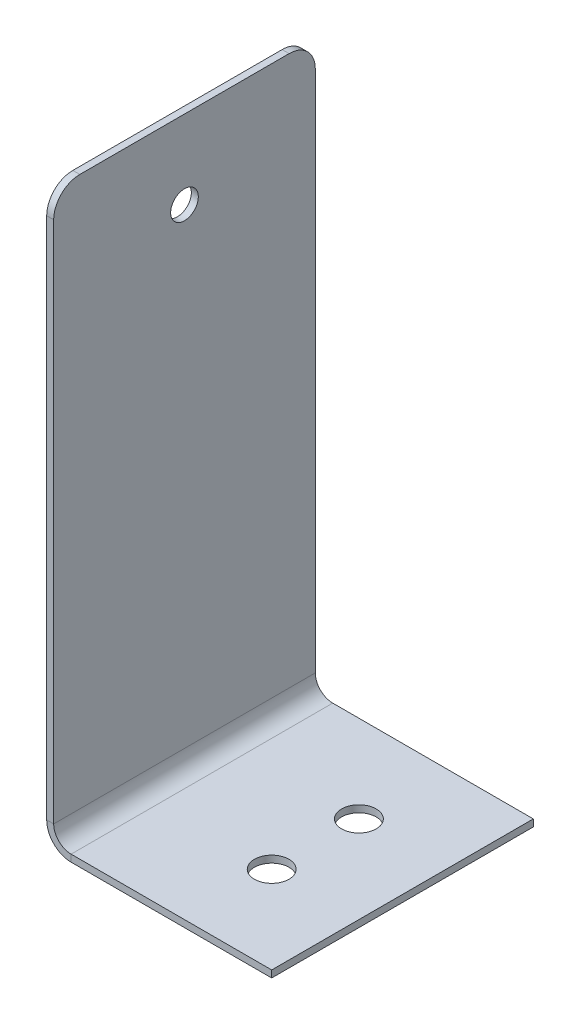
ISO-10303-21;
HEADER;
FILE_DESCRIPTION(('STEP AP214'),'2;1');
FILE_NAME('part.step','',(''),(''),'','','');
FILE_SCHEMA(('AUTOMOTIVE_DESIGN { 1 0 10303 214 1 1 1 1 }'));
ENDSEC;
DATA;
#1=APPLICATION_CONTEXT('core data for automotive mechanical design processes');
#2=APPLICATION_PROTOCOL_DEFINITION('international standard','automotive_design',2000,#1);
#3=PRODUCT_CONTEXT('',#1,'mechanical');
#4=PRODUCT('Part','Part','',(#3));
#5=PRODUCT_RELATED_PRODUCT_CATEGORY('part','',(#4));
#6=PRODUCT_DEFINITION_FORMATION('','',#4);
#7=PRODUCT_DEFINITION_CONTEXT('part definition',#1,'design');
#8=PRODUCT_DEFINITION('design','',#6,#7);
#9=PRODUCT_DEFINITION_SHAPE('','',#8);
#10=(LENGTH_UNIT() NAMED_UNIT(*) SI_UNIT(.MILLI.,.METRE.));
#11=(NAMED_UNIT(*) PLANE_ANGLE_UNIT() SI_UNIT($,.RADIAN.));
#12=(NAMED_UNIT(*) SI_UNIT($,.STERADIAN.) SOLID_ANGLE_UNIT());
#13=UNCERTAINTY_MEASURE_WITH_UNIT(LENGTH_MEASURE(1.E-05),#10,'distance_accuracy_value','');
#14=(GEOMETRIC_REPRESENTATION_CONTEXT(3) GLOBAL_UNCERTAINTY_ASSIGNED_CONTEXT((#13)) GLOBAL_UNIT_ASSIGNED_CONTEXT((#10,
#11,#12)) REPRESENTATION_CONTEXT('',''));
#15=CARTESIAN_POINT('',(0.,0.,0.));
#16=DIRECTION('',(0.,0.,1.));
#17=DIRECTION('',(1.,0.,0.));
#18=AXIS2_PLACEMENT_3D('',#15,#16,#17);
#19=CARTESIAN_POINT('',(2.,0.,15.));
#20=DIRECTION('',(0.,0.,1.));
#21=DIRECTION('',(1.,0.,0.));
#22=AXIS2_PLACEMENT_3D('',#19,#20,#21);
#23=PLANE('',#22);
#24=DIRECTION('',(0.,-1.,0.));
#25=VECTOR('',#24,1.);
#26=CARTESIAN_POINT('',(2.,0.,15.));
#27=LINE('',#26,#25);
#28=CARTESIAN_POINT('',(2.,0.,15.));
#29=VERTEX_POINT('',#28);
#30=CARTESIAN_POINT('',(2.,-0.800000000000001,15.));
#31=VERTEX_POINT('',#30);
#32=EDGE_CURVE('E197',#29,#31,#27,.T.);
#33=ORIENTED_EDGE('',*,*,#32,.F.);
#34=CARTESIAN_POINT('',(2.,2.,15.));
#35=DIRECTION('',(0.,0.,-1.));
#36=DIRECTION('',(-1.,0.,0.));
#37=AXIS2_PLACEMENT_3D('',#34,#35,#36);
#38=CIRCLE('',#37,2.);
#39=CARTESIAN_POINT('',(0.,2.,15.));
#40=VERTEX_POINT('',#39);
#41=EDGE_CURVE('E165',#40,#29,#38,.F.);
#42=ORIENTED_EDGE('',*,*,#41,.F.);
#43=DIRECTION('',(1.,0.,0.));
#44=VECTOR('',#43,1.);
#45=CARTESIAN_POINT('',(-0.799999999999995,2.,15.));
#46=LINE('',#45,#44);
#47=CARTESIAN_POINT('',(-0.799999999999995,2.,15.));
#48=VERTEX_POINT('',#47);
#49=EDGE_CURVE('E194',#48,#40,#46,.T.);
#50=ORIENTED_EDGE('',*,*,#49,.F.);
#51=CARTESIAN_POINT('',(2.,2.,15.));
#52=DIRECTION('',(0.,0.,1.));
#53=DIRECTION('',(1.,0.,0.));
#54=AXIS2_PLACEMENT_3D('',#51,#52,#53);
#55=CIRCLE('',#54,2.8);
#56=EDGE_CURVE('E172',#48,#31,#55,.T.);
#57=ORIENTED_EDGE('',*,*,#56,.T.);
#58=EDGE_LOOP('',(#33,#42,#50,#57));
#59=FACE_BOUND('',#58,.T.);
#60=ADVANCED_FACE('F38',(#59),#23,.T.);
#61=CARTESIAN_POINT('',(-0.799999999999995,2.,15.));
#62=DIRECTION('',(0.,0.,1.));
#63=DIRECTION('',(1.,0.,0.));
#64=AXIS2_PLACEMENT_3D('',#61,#62,#63);
#65=PLANE('',#64);
#66=DIRECTION('',(1.,0.,0.));
#67=VECTOR('',#66,1.);
#68=CARTESIAN_POINT('',(0.,0.,15.));
#69=LINE('',#68,#67);
#70=CARTESIAN_POINT('',(25.,0.,15.));
#71=VERTEX_POINT('',#70);
#72=EDGE_CURVE('E162',#29,#71,#69,.T.);
#73=ORIENTED_EDGE('',*,*,#72,.F.);
#74=ORIENTED_EDGE('',*,*,#32,.T.);
#75=DIRECTION('',(1.,0.,0.));
#76=VECTOR('',#75,1.);
#77=CARTESIAN_POINT('',(0.,-0.800000000000001,15.));
#78=LINE('',#77,#76);
#79=CARTESIAN_POINT('',(25.,-0.800000000000001,15.));
#80=VERTEX_POINT('',#79);
#81=EDGE_CURVE('E159',#31,#80,#78,.T.);
#82=ORIENTED_EDGE('',*,*,#81,.T.);
#83=DIRECTION('',(0.,-1.,0.));
#84=VECTOR('',#83,1.);
#85=CARTESIAN_POINT('',(25.,0.,15.));
#86=LINE('',#85,#84);
#87=EDGE_CURVE('E122',#71,#80,#86,.T.);
#88=ORIENTED_EDGE('',*,*,#87,.F.);
#89=EDGE_LOOP('',(#73,#74,#82,#88));
#90=FACE_BOUND('',#89,.T.);
#91=ADVANCED_FACE('F244',(#90),#65,.T.);
#92=CARTESIAN_POINT('',(0.,2.,-15.));
#93=DIRECTION('',(0.,0.,-1.));
#94=DIRECTION('',(-1.,0.,0.));
#95=AXIS2_PLACEMENT_3D('',#92,#93,#94);
#96=PLANE('',#95);
#97=DIRECTION('',(-1.,0.,0.));
#98=VECTOR('',#97,1.);
#99=CARTESIAN_POINT('',(0.,2.,-15.));
#100=LINE('',#99,#98);
#101=CARTESIAN_POINT('',(0.,2.,-15.));
#102=VERTEX_POINT('',#101);
#103=CARTESIAN_POINT('',(-0.799999999999995,2.,-15.));
#104=VERTEX_POINT('',#103);
#105=EDGE_CURVE('E191',#102,#104,#100,.T.);
#106=ORIENTED_EDGE('',*,*,#105,.F.);
#107=CARTESIAN_POINT('',(2.,2.,-15.));
#108=DIRECTION('',(0.,0.,-1.));
#109=DIRECTION('',(-1.,0.,0.));
#110=AXIS2_PLACEMENT_3D('',#107,#108,#109);
#111=CIRCLE('',#110,2.);
#112=CARTESIAN_POINT('',(2.,0.,-15.));
#113=VERTEX_POINT('',#112);
#114=EDGE_CURVE('E150',#102,#113,#111,.F.);
#115=ORIENTED_EDGE('',*,*,#114,.T.);
#116=DIRECTION('',(0.,1.,0.));
#117=VECTOR('',#116,1.);
#118=CARTESIAN_POINT('',(2.,-0.800000000000001,-15.));
#119=LINE('',#118,#117);
#120=CARTESIAN_POINT('',(2.,-0.800000000000001,-15.));
#121=VERTEX_POINT('',#120);
#122=EDGE_CURVE('E126',#121,#113,#119,.T.);
#123=ORIENTED_EDGE('',*,*,#122,.F.);
#124=CARTESIAN_POINT('',(2.,2.,-15.));
#125=DIRECTION('',(0.,0.,1.));
#126=DIRECTION('',(1.,0.,0.));
#127=AXIS2_PLACEMENT_3D('',#124,#125,#126);
#128=CIRCLE('',#127,2.8);
#129=EDGE_CURVE('E157',#104,#121,#128,.T.);
#130=ORIENTED_EDGE('',*,*,#129,.F.);
#131=EDGE_LOOP('',(#106,#115,#123,#130));
#132=FACE_BOUND('',#131,.T.);
#133=ADVANCED_FACE('F246',(#132),#96,.T.);
#134=CARTESIAN_POINT('',(2.,-0.800000000000001,-15.));
#135=DIRECTION('',(0.,0.,-1.));
#136=DIRECTION('',(-1.,0.,0.));
#137=AXIS2_PLACEMENT_3D('',#134,#135,#136);
#138=PLANE('',#137);
#139=DIRECTION('',(0.,1.,0.));
#140=VECTOR('',#139,1.);
#141=CARTESIAN_POINT('',(-0.799999999999995,0.,-15.));
#142=LINE('',#141,#140);
#143=CARTESIAN_POINT('',(-0.800000000000023,62.,-15.));
#144=VERTEX_POINT('',#143);
#145=EDGE_CURVE('E155',#144,#104,#142,.F.);
#146=ORIENTED_EDGE('',*,*,#145,.F.);
#147=DIRECTION('',(1.,0.,0.));
#148=VECTOR('',#147,1.);
#149=CARTESIAN_POINT('',(1.99999999999997,62.0000000000001,-15.));
#150=LINE('',#149,#148);
#151=CARTESIAN_POINT('',(0.,62.,-15.));
#152=VERTEX_POINT('',#151);
#153=EDGE_CURVE('E199',#144,#152,#150,.T.);
#154=ORIENTED_EDGE('',*,*,#153,.T.);
#155=DIRECTION('',(0.,-1.,0.));
#156=VECTOR('',#155,1.);
#157=CARTESIAN_POINT('',(0.,0.,-15.));
#158=LINE('',#157,#156);
#159=EDGE_CURVE('E153',#152,#102,#158,.T.);
#160=ORIENTED_EDGE('',*,*,#159,.T.);
#161=ORIENTED_EDGE('',*,*,#105,.T.);
#162=EDGE_LOOP('',(#146,#154,#160,#161));
#163=FACE_BOUND('',#162,.T.);
#164=ADVANCED_FACE('F219',(#163),#138,.T.);
#165=CARTESIAN_POINT('',(0.,-0.800000000000001,15.));
#166=DIRECTION('',(0.,1.,0.));
#167=DIRECTION('',(0.,0.,1.));
#168=AXIS2_PLACEMENT_3D('',#165,#166,#167);
#169=PLANE('',#168);
#170=CARTESIAN_POINT('',(15.,-0.800000000000002,-5.));
#171=DIRECTION('',(0.,1.,0.));
#172=DIRECTION('',(0.,0.,1.));
#173=AXIS2_PLACEMENT_3D('',#170,#171,#172);
#174=CIRCLE('',#173,1.984375);
#175=CARTESIAN_POINT('',(15.,-0.800000000000002,-3.015625));
#176=VERTEX_POINT('',#175);
#177=EDGE_CURVE('E448',#176,#176,#174,.T.);
#178=ORIENTED_EDGE('',*,*,#177,.T.);
#179=EDGE_LOOP('',(#178));
#180=FACE_BOUND('',#179,.T.);
#181=CARTESIAN_POINT('',(15.,-0.800000000000002,5.));
#182=DIRECTION('',(0.,1.,0.));
#183=DIRECTION('',(0.,0.,1.));
#184=AXIS2_PLACEMENT_3D('',#181,#182,#183);
#185=CIRCLE('',#184,1.984375);
#186=CARTESIAN_POINT('',(15.,-0.800000000000002,6.984375));
#187=VERTEX_POINT('',#186);
#188=EDGE_CURVE('E451',#187,#187,#185,.T.);
#189=ORIENTED_EDGE('',*,*,#188,.T.);
#190=EDGE_LOOP('',(#189));
#191=FACE_BOUND('',#190,.T.);
#192=DIRECTION('',(0.,0.,-1.));
#193=VECTOR('',#192,1.);
#194=CARTESIAN_POINT('',(2.,-0.800000000000001,15.));
#195=LINE('',#194,#193);
#196=EDGE_CURVE('E141',#31,#121,#195,.T.);
#197=ORIENTED_EDGE('',*,*,#196,.T.);
#198=DIRECTION('',(1.,0.,0.));
#199=VECTOR('',#198,1.);
#200=CARTESIAN_POINT('',(0.,-0.800000000000001,-15.));
#201=LINE('',#200,#199);
#202=CARTESIAN_POINT('',(25.,-0.800000000000001,-15.));
#203=VERTEX_POINT('',#202);
#204=EDGE_CURVE('E133',#121,#203,#201,.T.);
#205=ORIENTED_EDGE('',*,*,#204,.T.);
#206=DIRECTION('',(0.,0.,-1.));
#207=VECTOR('',#206,1.);
#208=CARTESIAN_POINT('',(25.,-0.800000000000001,15.));
#209=LINE('',#208,#207);
#210=EDGE_CURVE('E117',#80,#203,#209,.T.);
#211=ORIENTED_EDGE('',*,*,#210,.F.);
#212=ORIENTED_EDGE('',*,*,#81,.F.);
#213=EDGE_LOOP('',(#197,#205,#211,#212));
#214=FACE_BOUND('',#213,.T.);
#215=ADVANCED_FACE('F139',(#180,#191,#214),#169,.F.);
#216=CARTESIAN_POINT('',(25.,0.,15.));
#217=DIRECTION('',(1.,0.,0.));
#218=DIRECTION('',(0.,0.,-1.));
#219=AXIS2_PLACEMENT_3D('',#216,#217,#218);
#220=PLANE('',#219);
#221=ORIENTED_EDGE('',*,*,#210,.T.);
#222=DIRECTION('',(0.,-1.,0.));
#223=VECTOR('',#222,1.);
#224=CARTESIAN_POINT('',(25.,0.,-15.));
#225=LINE('',#224,#223);
#226=CARTESIAN_POINT('',(25.,0.,-15.));
#227=VERTEX_POINT('',#226);
#228=EDGE_CURVE('E120',#227,#203,#225,.T.);
#229=ORIENTED_EDGE('',*,*,#228,.F.);
#230=DIRECTION('',(0.,0.,-1.));
#231=VECTOR('',#230,1.);
#232=CARTESIAN_POINT('',(25.,0.,15.));
#233=LINE('',#232,#231);
#234=EDGE_CURVE('E127',#71,#227,#233,.T.);
#235=ORIENTED_EDGE('',*,*,#234,.F.);
#236=ORIENTED_EDGE('',*,*,#87,.T.);
#237=EDGE_LOOP('',(#221,#229,#235,#236));
#238=FACE_BOUND('',#237,.T.);
#239=ADVANCED_FACE('F119',(#238),#220,.T.);
#240=CARTESIAN_POINT('',(0.,0.,15.));
#241=DIRECTION('',(0.,1.,0.));
#242=DIRECTION('',(0.,0.,1.));
#243=AXIS2_PLACEMENT_3D('',#240,#241,#242);
#244=PLANE('',#243);
#245=CARTESIAN_POINT('',(15.,0.,-5.));
#246=DIRECTION('',(0.,1.,0.));
#247=DIRECTION('',(0.,0.,1.));
#248=AXIS2_PLACEMENT_3D('',#245,#246,#247);
#249=CIRCLE('',#248,1.984375);
#250=CARTESIAN_POINT('',(15.,0.,-3.015625));
#251=VERTEX_POINT('',#250);
#252=EDGE_CURVE('E460',#251,#251,#249,.T.);
#253=ORIENTED_EDGE('',*,*,#252,.F.);
#254=EDGE_LOOP('',(#253));
#255=FACE_BOUND('',#254,.T.);
#256=CARTESIAN_POINT('',(15.,0.,5.));
#257=DIRECTION('',(0.,1.,0.));
#258=DIRECTION('',(0.,0.,1.));
#259=AXIS2_PLACEMENT_3D('',#256,#257,#258);
#260=CIRCLE('',#259,1.984375);
#261=CARTESIAN_POINT('',(15.,0.,6.984375));
#262=VERTEX_POINT('',#261);
#263=EDGE_CURVE('E453',#262,#262,#260,.T.);
#264=ORIENTED_EDGE('',*,*,#263,.F.);
#265=EDGE_LOOP('',(#264));
#266=FACE_BOUND('',#265,.T.);
#267=ORIENTED_EDGE('',*,*,#234,.T.);
#268=DIRECTION('',(1.,0.,0.));
#269=VECTOR('',#268,1.);
#270=CARTESIAN_POINT('',(0.,0.,-15.));
#271=LINE('',#270,#269);
#272=EDGE_CURVE('E136',#113,#227,#271,.T.);
#273=ORIENTED_EDGE('',*,*,#272,.F.);
#274=DIRECTION('',(0.,0.,-1.));
#275=VECTOR('',#274,1.);
#276=CARTESIAN_POINT('',(2.,0.,15.));
#277=LINE('',#276,#275);
#278=EDGE_CURVE('E186',#29,#113,#277,.T.);
#279=ORIENTED_EDGE('',*,*,#278,.F.);
#280=ORIENTED_EDGE('',*,*,#72,.T.);
#281=EDGE_LOOP('',(#267,#273,#279,#280));
#282=FACE_BOUND('',#281,.T.);
#283=ADVANCED_FACE('F243',(#255,#266,#282),#244,.T.);
#284=CARTESIAN_POINT('',(2.,2.,15.));
#285=DIRECTION('',(0.,0.,-1.));
#286=DIRECTION('',(-1.,0.,0.));
#287=AXIS2_PLACEMENT_3D('',#284,#285,#286);
#288=CYLINDRICAL_SURFACE('',#287,2.);
#289=ORIENTED_EDGE('',*,*,#278,.T.);
#290=ORIENTED_EDGE('',*,*,#114,.F.);
#291=DIRECTION('',(0.,0.,-1.));
#292=VECTOR('',#291,1.);
#293=CARTESIAN_POINT('',(0.,2.,15.));
#294=LINE('',#293,#292);
#295=EDGE_CURVE('E183',#40,#102,#294,.T.);
#296=ORIENTED_EDGE('',*,*,#295,.F.);
#297=ORIENTED_EDGE('',*,*,#41,.T.);
#298=EDGE_LOOP('',(#289,#290,#296,#297));
#299=FACE_BOUND('',#298,.T.);
#300=ADVANCED_FACE('F237',(#299),#288,.F.);
#301=CARTESIAN_POINT('',(0.,0.,15.));
#302=DIRECTION('',(1.,0.,0.));
#303=DIRECTION('',(0.,0.,-1.));
#304=AXIS2_PLACEMENT_3D('',#301,#302,#303);
#305=PLANE('',#304);
#306=CARTESIAN_POINT('',(0.,55.9900000000001,0.));
#307=DIRECTION('',(1.,0.,0.));
#308=DIRECTION('',(0.,0.,-1.));
#309=AXIS2_PLACEMENT_3D('',#306,#307,#308);
#310=CIRCLE('',#309,1.5875);
#311=CARTESIAN_POINT('',(0.,55.9900000000001,-1.5875));
#312=VERTEX_POINT('',#311);
#313=EDGE_CURVE('E145',#312,#312,#310,.T.);
#314=ORIENTED_EDGE('',*,*,#313,.F.);
#315=EDGE_LOOP('',(#314));
#316=FACE_BOUND('',#315,.T.);
#317=ORIENTED_EDGE('',*,*,#159,.F.);
#318=CARTESIAN_POINT('',(0.,62.,-12.));
#319=DIRECTION('',(1.,0.,0.));
#320=DIRECTION('',(0.,0.,-1.));
#321=AXIS2_PLACEMENT_3D('',#318,#319,#320);
#322=CIRCLE('',#321,3.);
#323=CARTESIAN_POINT('',(0.,65.0000000000001,-12.));
#324=VERTEX_POINT('',#323);
#325=EDGE_CURVE('E204',#152,#324,#322,.T.);
#326=ORIENTED_EDGE('',*,*,#325,.T.);
#327=DIRECTION('',(0.,0.,-1.));
#328=VECTOR('',#327,1.);
#329=CARTESIAN_POINT('',(0.,65.0000000000001,15.));
#330=LINE('',#329,#328);
#331=CARTESIAN_POINT('',(0.,65.0000000000001,12.));
#332=VERTEX_POINT('',#331);
#333=EDGE_CURVE('E181',#332,#324,#330,.T.);
#334=ORIENTED_EDGE('',*,*,#333,.F.);
#335=CARTESIAN_POINT('',(0.,62.,12.));
#336=DIRECTION('',(1.,0.,0.));
#337=DIRECTION('',(0.,0.,-1.));
#338=AXIS2_PLACEMENT_3D('',#335,#336,#337);
#339=CIRCLE('',#338,3.);
#340=CARTESIAN_POINT('',(0.,62.,15.));
#341=VERTEX_POINT('',#340);
#342=EDGE_CURVE('E202',#332,#341,#339,.T.);
#343=ORIENTED_EDGE('',*,*,#342,.T.);
#344=DIRECTION('',(0.,-1.,0.));
#345=VECTOR('',#344,1.);
#346=CARTESIAN_POINT('',(0.,0.,15.));
#347=LINE('',#346,#345);
#348=EDGE_CURVE('E168',#341,#40,#347,.T.);
#349=ORIENTED_EDGE('',*,*,#348,.T.);
#350=ORIENTED_EDGE('',*,*,#295,.T.);
#351=EDGE_LOOP('',(#317,#326,#334,#343,#349,#350));
#352=FACE_BOUND('',#351,.T.);
#353=ADVANCED_FACE('F225',(#316,#352),#305,.T.);
#354=CARTESIAN_POINT('',(-0.799999999999995,65.0000000000001,15.));
#355=DIRECTION('',(0.,1.,0.));
#356=DIRECTION('',(0.,0.,1.));
#357=AXIS2_PLACEMENT_3D('',#354,#355,#356);
#358=PLANE('',#357);
#359=ORIENTED_EDGE('',*,*,#333,.T.);
#360=DIRECTION('',(1.,0.,0.));
#361=VECTOR('',#360,1.);
#362=CARTESIAN_POINT('',(-0.799999999999995,65.0000000000001,-12.));
#363=LINE('',#362,#361);
#364=CARTESIAN_POINT('',(-0.799999999999995,65.0000000000001,-12.));
#365=VERTEX_POINT('',#364);
#366=EDGE_CURVE('E59',#324,#365,#363,.F.);
#367=ORIENTED_EDGE('',*,*,#366,.T.);
#368=DIRECTION('',(0.,0.,-1.));
#369=VECTOR('',#368,1.);
#370=CARTESIAN_POINT('',(-0.799999999999995,65.0000000000001,15.));
#371=LINE('',#370,#369);
#372=CARTESIAN_POINT('',(-0.799999999999995,65.0000000000001,12.));
#373=VERTEX_POINT('',#372);
#374=EDGE_CURVE('E179',#373,#365,#371,.T.);
#375=ORIENTED_EDGE('',*,*,#374,.F.);
#376=DIRECTION('',(1.,0.,0.));
#377=VECTOR('',#376,1.);
#378=CARTESIAN_POINT('',(0.,65.0000000000001,12.));
#379=LINE('',#378,#377);
#380=EDGE_CURVE('E206',#373,#332,#379,.T.);
#381=ORIENTED_EDGE('',*,*,#380,.T.);
#382=EDGE_LOOP('',(#359,#367,#375,#381));
#383=FACE_BOUND('',#382,.T.);
#384=ADVANCED_FACE('F226',(#383),#358,.T.);
#385=CARTESIAN_POINT('',(-0.799999999999995,0.,15.));
#386=DIRECTION('',(1.,0.,0.));
#387=DIRECTION('',(0.,0.,-1.));
#388=AXIS2_PLACEMENT_3D('',#385,#386,#387);
#389=PLANE('',#388);
#390=CARTESIAN_POINT('',(-0.799999999999995,55.9900000000001,0.));
#391=DIRECTION('',(1.,0.,0.));
#392=DIRECTION('',(0.,0.,-1.));
#393=AXIS2_PLACEMENT_3D('',#390,#391,#392);
#394=CIRCLE('',#393,1.5875);
#395=CARTESIAN_POINT('',(-0.799999999999995,55.9900000000001,-1.5875));
#396=VERTEX_POINT('',#395);
#397=EDGE_CURVE('E142',#396,#396,#394,.T.);
#398=ORIENTED_EDGE('',*,*,#397,.T.);
#399=EDGE_LOOP('',(#398));
#400=FACE_BOUND('',#399,.T.);
#401=ORIENTED_EDGE('',*,*,#374,.T.);
#402=CARTESIAN_POINT('',(-0.800000000000023,62.,-12.));
#403=DIRECTION('',(1.,0.,0.));
#404=DIRECTION('',(0.,0.,-1.));
#405=AXIS2_PLACEMENT_3D('',#402,#403,#404);
#406=CIRCLE('',#405,3.);
#407=EDGE_CURVE('E46',#365,#144,#406,.F.);
#408=ORIENTED_EDGE('',*,*,#407,.T.);
#409=ORIENTED_EDGE('',*,*,#145,.T.);
#410=DIRECTION('',(0.,0.,-1.));
#411=VECTOR('',#410,1.);
#412=CARTESIAN_POINT('',(-0.799999999999995,2.,15.));
#413=LINE('',#412,#411);
#414=EDGE_CURVE('E176',#48,#104,#413,.T.);
#415=ORIENTED_EDGE('',*,*,#414,.F.);
#416=DIRECTION('',(0.,1.,0.));
#417=VECTOR('',#416,1.);
#418=CARTESIAN_POINT('',(-0.799999999999995,0.,15.));
#419=LINE('',#418,#417);
#420=CARTESIAN_POINT('',(-0.799999999999995,62.,15.));
#421=VERTEX_POINT('',#420);
#422=EDGE_CURVE('E170',#421,#48,#419,.F.);
#423=ORIENTED_EDGE('',*,*,#422,.F.);
#424=CARTESIAN_POINT('',(-0.799999999999995,62.,12.));
#425=DIRECTION('',(1.,0.,0.));
#426=DIRECTION('',(0.,0.,-1.));
#427=AXIS2_PLACEMENT_3D('',#424,#425,#426);
#428=CIRCLE('',#427,3.);
#429=EDGE_CURVE('E210',#421,#373,#428,.F.);
#430=ORIENTED_EDGE('',*,*,#429,.T.);
#431=EDGE_LOOP('',(#401,#408,#409,#415,#423,#430));
#432=FACE_BOUND('',#431,.T.);
#433=ADVANCED_FACE('F214',(#400,#432),#389,.F.);
#434=CARTESIAN_POINT('',(2.,2.,15.));
#435=DIRECTION('',(0.,0.,-1.));
#436=DIRECTION('',(-1.,0.,0.));
#437=AXIS2_PLACEMENT_3D('',#434,#435,#436);
#438=CYLINDRICAL_SURFACE('',#437,2.8);
#439=ORIENTED_EDGE('',*,*,#414,.T.);
#440=ORIENTED_EDGE('',*,*,#129,.T.);
#441=ORIENTED_EDGE('',*,*,#196,.F.);
#442=ORIENTED_EDGE('',*,*,#56,.F.);
#443=EDGE_LOOP('',(#439,#440,#441,#442));
#444=FACE_BOUND('',#443,.T.);
#445=ADVANCED_FACE('F281',(#444),#438,.T.);
#446=CARTESIAN_POINT('',(2.,2.,15.));
#447=DIRECTION('',(0.,0.,-1.));
#448=DIRECTION('',(-1.,0.,0.));
#449=AXIS2_PLACEMENT_3D('',#446,#447,#448);
#450=PLANE('',#449);
#451=ORIENTED_EDGE('',*,*,#348,.F.);
#452=DIRECTION('',(1.,0.,0.));
#453=VECTOR('',#452,1.);
#454=CARTESIAN_POINT('',(-0.799999999999995,62.,15.));
#455=LINE('',#454,#453);
#456=EDGE_CURVE('E11',#341,#421,#455,.F.);
#457=ORIENTED_EDGE('',*,*,#456,.T.);
#458=ORIENTED_EDGE('',*,*,#422,.T.);
#459=ORIENTED_EDGE('',*,*,#49,.T.);
#460=EDGE_LOOP('',(#451,#457,#458,#459));
#461=FACE_BOUND('',#460,.T.);
#462=ADVANCED_FACE('F230',(#461),#450,.F.);
#463=CARTESIAN_POINT('',(2.,2.,-15.));
#464=DIRECTION('',(0.,0.,-1.));
#465=DIRECTION('',(-1.,0.,0.));
#466=AXIS2_PLACEMENT_3D('',#463,#464,#465);
#467=PLANE('',#466);
#468=ORIENTED_EDGE('',*,*,#204,.F.);
#469=ORIENTED_EDGE('',*,*,#122,.T.);
#470=ORIENTED_EDGE('',*,*,#272,.T.);
#471=ORIENTED_EDGE('',*,*,#228,.T.);
#472=EDGE_LOOP('',(#468,#469,#470,#471));
#473=FACE_BOUND('',#472,.T.);
#474=ADVANCED_FACE('F132',(#473),#467,.T.);
#475=CARTESIAN_POINT('',(-0.799999999999995,55.9900000000001,0.));
#476=DIRECTION('',(1.,0.,0.));
#477=DIRECTION('',(0.,0.,-1.));
#478=AXIS2_PLACEMENT_3D('',#475,#476,#477);
#479=CYLINDRICAL_SURFACE('',#478,1.5875);
#480=ORIENTED_EDGE('',*,*,#397,.F.);
#481=EDGE_LOOP('',(#480));
#482=FACE_BOUND('',#481,.T.);
#483=ORIENTED_EDGE('',*,*,#313,.T.);
#484=EDGE_LOOP('',(#483));
#485=FACE_BOUND('',#484,.T.);
#486=ADVANCED_FACE('F268',(#482,#485),#479,.F.);
#487=CARTESIAN_POINT('',(15.,-10.,5.));
#488=DIRECTION('',(0.,1.,0.));
#489=DIRECTION('',(0.,0.,1.));
#490=AXIS2_PLACEMENT_3D('',#487,#488,#489);
#491=CYLINDRICAL_SURFACE('',#490,1.984375);
#492=ORIENTED_EDGE('',*,*,#263,.T.);
#493=EDGE_LOOP('',(#492));
#494=FACE_BOUND('',#493,.T.);
#495=ORIENTED_EDGE('',*,*,#188,.F.);
#496=EDGE_LOOP('',(#495));
#497=FACE_BOUND('',#496,.T.);
#498=ADVANCED_FACE('F262',(#494,#497),#491,.F.);
#499=CARTESIAN_POINT('',(14.9999999999999,-10.,-5.));
#500=DIRECTION('',(0.,1.,0.));
#501=DIRECTION('',(0.,0.,1.));
#502=AXIS2_PLACEMENT_3D('',#499,#500,#501);
#503=CYLINDRICAL_SURFACE('',#502,1.984375);
#504=ORIENTED_EDGE('',*,*,#252,.T.);
#505=EDGE_LOOP('',(#504));
#506=FACE_BOUND('',#505,.T.);
#507=ORIENTED_EDGE('',*,*,#177,.F.);
#508=EDGE_LOOP('',(#507));
#509=FACE_BOUND('',#508,.T.);
#510=ADVANCED_FACE('F257',(#506,#509),#503,.F.);
#511=CARTESIAN_POINT('',(1.99999999999997,62.0000000000001,-12.));
#512=DIRECTION('',(1.,0.,0.));
#513=DIRECTION('',(0.,0.,-1.));
#514=AXIS2_PLACEMENT_3D('',#511,#512,#513);
#515=CYLINDRICAL_SURFACE('',#514,3.);
#516=ORIENTED_EDGE('',*,*,#407,.F.);
#517=ORIENTED_EDGE('',*,*,#366,.F.);
#518=ORIENTED_EDGE('',*,*,#325,.F.);
#519=ORIENTED_EDGE('',*,*,#153,.F.);
#520=EDGE_LOOP('',(#516,#517,#518,#519));
#521=FACE_BOUND('',#520,.T.);
#522=ADVANCED_FACE('F222',(#521),#515,.T.);
#523=CARTESIAN_POINT('',(-0.799999999999995,62.,12.));
#524=DIRECTION('',(-1.,0.,0.));
#525=DIRECTION('',(0.,0.,1.));
#526=AXIS2_PLACEMENT_3D('',#523,#524,#525);
#527=CYLINDRICAL_SURFACE('',#526,3.);
#528=ORIENTED_EDGE('',*,*,#429,.F.);
#529=ORIENTED_EDGE('',*,*,#456,.F.);
#530=ORIENTED_EDGE('',*,*,#342,.F.);
#531=ORIENTED_EDGE('',*,*,#380,.F.);
#532=EDGE_LOOP('',(#528,#529,#530,#531));
#533=FACE_BOUND('',#532,.T.);
#534=ADVANCED_FACE('F40',(#533),#527,.T.);
#535=CLOSED_SHELL('',(#60,#91,#133,#164,#215,#239,#283,#300,#353,#384,#433,#445,#462,#474,#486,
#498,#510,#522,#534));
#536=MANIFOLD_SOLID_BREP('B2',#535);
#537=ADVANCED_BREP_SHAPE_REPRESENTATION('',(#18,#536),#14);
#538=SHAPE_DEFINITION_REPRESENTATION(#9,#537);
ENDSEC;
END-ISO-10303-21;
